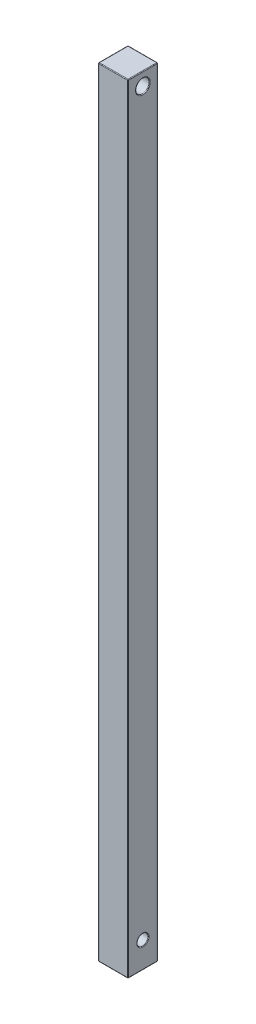
ISO-10303-21;
HEADER;
FILE_DESCRIPTION(('STEP AP214'),'2;1');
FILE_NAME('part.step','',(''),(''),'','','');
FILE_SCHEMA(('AUTOMOTIVE_DESIGN { 1 0 10303 214 1 1 1 1 }'));
ENDSEC;
DATA;
#1=APPLICATION_CONTEXT('core data for automotive mechanical design processes');
#2=APPLICATION_PROTOCOL_DEFINITION('international standard','automotive_design',2000,#1);
#3=PRODUCT_CONTEXT('',#1,'mechanical');
#4=PRODUCT('Part','Part','',(#3));
#5=PRODUCT_RELATED_PRODUCT_CATEGORY('part','',(#4));
#6=PRODUCT_DEFINITION_FORMATION('','',#4);
#7=PRODUCT_DEFINITION_CONTEXT('part definition',#1,'design');
#8=PRODUCT_DEFINITION('design','',#6,#7);
#9=PRODUCT_DEFINITION_SHAPE('','',#8);
#10=(LENGTH_UNIT() NAMED_UNIT(*) SI_UNIT(.MILLI.,.METRE.));
#11=(NAMED_UNIT(*) PLANE_ANGLE_UNIT() SI_UNIT($,.RADIAN.));
#12=(NAMED_UNIT(*) SI_UNIT($,.STERADIAN.) SOLID_ANGLE_UNIT());
#13=UNCERTAINTY_MEASURE_WITH_UNIT(LENGTH_MEASURE(1.E-05),#10,'distance_accuracy_value','');
#14=(GEOMETRIC_REPRESENTATION_CONTEXT(3) GLOBAL_UNCERTAINTY_ASSIGNED_CONTEXT((#13)) GLOBAL_UNIT_ASSIGNED_CONTEXT((#10,
#11,#12)) REPRESENTATION_CONTEXT('',''));
#15=CARTESIAN_POINT('',(0.,0.,0.));
#16=DIRECTION('',(0.,0.,1.));
#17=DIRECTION('',(1.,0.,0.));
#18=AXIS2_PLACEMENT_3D('',#15,#16,#17);
#19=CARTESIAN_POINT('',(0.,600.,0.));
#20=DIRECTION('',(1.,0.,0.));
#21=DIRECTION('',(0.,0.,-1.));
#22=AXIS2_PLACEMENT_3D('',#19,#20,#21);
#23=PLANE('',#22);
#24=CARTESIAN_POINT('',(0.,20.,-11.5));
#25=DIRECTION('',(1.,0.,0.));
#26=DIRECTION('',(0.,0.,-1.));
#27=AXIS2_PLACEMENT_3D('',#24,#25,#26);
#28=CIRCLE('',#27,4.75);
#29=CARTESIAN_POINT('',(0.,20.,-16.25));
#30=VERTEX_POINT('',#29);
#31=EDGE_CURVE('E171',#30,#30,#28,.T.);
#32=ORIENTED_EDGE('',*,*,#31,.T.);
#33=EDGE_LOOP('',(#32));
#34=FACE_BOUND('',#33,.T.);
#35=CARTESIAN_POINT('',(0.,590.,-11.5));
#36=DIRECTION('',(1.,0.,0.));
#37=DIRECTION('',(0.,0.,-1.));
#38=AXIS2_PLACEMENT_3D('',#35,#36,#37);
#39=CIRCLE('',#38,5.74999999999998);
#40=CARTESIAN_POINT('',(0.,590.,-17.25));
#41=VERTEX_POINT('',#40);
#42=EDGE_CURVE('E168',#41,#41,#39,.T.);
#43=ORIENTED_EDGE('',*,*,#42,.T.);
#44=EDGE_LOOP('',(#43));
#45=FACE_BOUND('',#44,.T.);
#46=DIRECTION('',(0.,0.,1.));
#47=VECTOR('',#46,1.);
#48=CARTESIAN_POINT('',(0.,599.5,0.));
#49=LINE('',#48,#47);
#50=CARTESIAN_POINT('',(0.,599.5,-0.5));
#51=VERTEX_POINT('',#50);
#52=CARTESIAN_POINT('',(0.,599.5,-22.5));
#53=VERTEX_POINT('',#52);
#54=EDGE_CURVE('E130',#51,#53,#49,.F.);
#55=ORIENTED_EDGE('',*,*,#54,.T.);
#56=DIRECTION('',(0.,-1.,0.));
#57=VECTOR('',#56,1.);
#58=CARTESIAN_POINT('',(0.,600.,-22.5));
#59=LINE('',#58,#57);
#60=CARTESIAN_POINT('',(0.,0.499999999999945,-22.5));
#61=VERTEX_POINT('',#60);
#62=EDGE_CURVE('E166',#53,#61,#59,.T.);
#63=ORIENTED_EDGE('',*,*,#62,.T.);
#64=DIRECTION('',(0.,0.,1.));
#65=VECTOR('',#64,1.);
#66=CARTESIAN_POINT('',(0.,0.499999999999945,0.));
#67=LINE('',#66,#65);
#68=CARTESIAN_POINT('',(0.,0.499999999999945,-0.5));
#69=VERTEX_POINT('',#68);
#70=EDGE_CURVE('E159',#61,#69,#67,.T.);
#71=ORIENTED_EDGE('',*,*,#70,.T.);
#72=DIRECTION('',(0.,-1.,0.));
#73=VECTOR('',#72,1.);
#74=CARTESIAN_POINT('',(0.,600.,-0.5));
#75=LINE('',#74,#73);
#76=EDGE_CURVE('E157',#69,#51,#75,.F.);
#77=ORIENTED_EDGE('',*,*,#76,.T.);
#78=EDGE_LOOP('',(#55,#63,#71,#77));
#79=FACE_BOUND('',#78,.T.);
#80=ADVANCED_FACE('F34',(#34,#45,#79),#23,.F.);
#81=CARTESIAN_POINT('',(0.,600.,0.));
#82=DIRECTION('',(0.,0.,-1.));
#83=DIRECTION('',(-1.,0.,0.));
#84=AXIS2_PLACEMENT_3D('',#81,#82,#83);
#85=PLANE('',#84);
#86=DIRECTION('',(1.,0.,0.));
#87=VECTOR('',#86,1.);
#88=CARTESIAN_POINT('',(0.,599.5,0.));
#89=LINE('',#88,#87);
#90=CARTESIAN_POINT('',(22.5,599.5,0.));
#91=VERTEX_POINT('',#90);
#92=CARTESIAN_POINT('',(0.5,599.5,0.));
#93=VERTEX_POINT('',#92);
#94=EDGE_CURVE('E43',#91,#93,#89,.F.);
#95=ORIENTED_EDGE('',*,*,#94,.T.);
#96=DIRECTION('',(0.,-1.,0.));
#97=VECTOR('',#96,1.);
#98=CARTESIAN_POINT('',(0.5,600.,0.));
#99=LINE('',#98,#97);
#100=CARTESIAN_POINT('',(0.5,0.499999999999945,0.));
#101=VERTEX_POINT('',#100);
#102=EDGE_CURVE('E11',#93,#101,#99,.T.);
#103=ORIENTED_EDGE('',*,*,#102,.T.);
#104=DIRECTION('',(1.,0.,0.));
#105=VECTOR('',#104,1.);
#106=CARTESIAN_POINT('',(23.,0.499999999999945,0.));
#107=LINE('',#106,#105);
#108=CARTESIAN_POINT('',(22.5,0.499999999999945,0.));
#109=VERTEX_POINT('',#108);
#110=EDGE_CURVE('E219',#101,#109,#107,.T.);
#111=ORIENTED_EDGE('',*,*,#110,.T.);
#112=DIRECTION('',(0.,-1.,0.));
#113=VECTOR('',#112,1.);
#114=CARTESIAN_POINT('',(22.5,600.,0.));
#115=LINE('',#114,#113);
#116=EDGE_CURVE('E54',#109,#91,#115,.F.);
#117=ORIENTED_EDGE('',*,*,#116,.T.);
#118=EDGE_LOOP('',(#95,#103,#111,#117));
#119=FACE_BOUND('',#118,.T.);
#120=ADVANCED_FACE('F353',(#119),#85,.F.);
#121=CARTESIAN_POINT('',(23.,600.,0.));
#122=DIRECTION('',(-1.,0.,0.));
#123=DIRECTION('',(0.,0.,1.));
#124=AXIS2_PLACEMENT_3D('',#121,#122,#123);
#125=PLANE('',#124);
#126=CARTESIAN_POINT('',(23.,20.,-11.5));
#127=DIRECTION('',(-1.,0.,0.));
#128=DIRECTION('',(0.,0.,1.));
#129=AXIS2_PLACEMENT_3D('',#126,#127,#128);
#130=CIRCLE('',#129,4.75);
#131=CARTESIAN_POINT('',(23.,20.,-6.75));
#132=VERTEX_POINT('',#131);
#133=EDGE_CURVE('E216',#132,#132,#130,.T.);
#134=ORIENTED_EDGE('',*,*,#133,.T.);
#135=EDGE_LOOP('',(#134));
#136=FACE_BOUND('',#135,.T.);
#137=CARTESIAN_POINT('',(23.,590.,-11.5));
#138=DIRECTION('',(-1.,0.,0.));
#139=DIRECTION('',(0.,0.,1.));
#140=AXIS2_PLACEMENT_3D('',#137,#138,#139);
#141=CIRCLE('',#140,5.74999999999998);
#142=CARTESIAN_POINT('',(23.,590.,-5.75000000000002));
#143=VERTEX_POINT('',#142);
#144=EDGE_CURVE('E213',#143,#143,#141,.T.);
#145=ORIENTED_EDGE('',*,*,#144,.T.);
#146=EDGE_LOOP('',(#145));
#147=FACE_BOUND('',#146,.T.);
#148=DIRECTION('',(0.,-1.,0.));
#149=VECTOR('',#148,1.);
#150=CARTESIAN_POINT('',(23.,600.,-22.5));
#151=LINE('',#150,#149);
#152=CARTESIAN_POINT('',(23.,0.499999999999945,-22.5));
#153=VERTEX_POINT('',#152);
#154=CARTESIAN_POINT('',(23.,599.5,-22.5));
#155=VERTEX_POINT('',#154);
#156=EDGE_CURVE('E208',#153,#155,#151,.F.);
#157=ORIENTED_EDGE('',*,*,#156,.T.);
#158=DIRECTION('',(0.,0.,-1.));
#159=VECTOR('',#158,1.);
#160=CARTESIAN_POINT('',(23.,599.5,0.));
#161=LINE('',#160,#159);
#162=CARTESIAN_POINT('',(23.,599.5,-0.5));
#163=VERTEX_POINT('',#162);
#164=EDGE_CURVE('E210',#155,#163,#161,.F.);
#165=ORIENTED_EDGE('',*,*,#164,.T.);
#166=DIRECTION('',(0.,-1.,0.));
#167=VECTOR('',#166,1.);
#168=CARTESIAN_POINT('',(23.,600.,-0.5));
#169=LINE('',#168,#167);
#170=CARTESIAN_POINT('',(23.,0.499999999999945,-0.5));
#171=VERTEX_POINT('',#170);
#172=EDGE_CURVE('E204',#163,#171,#169,.T.);
#173=ORIENTED_EDGE('',*,*,#172,.T.);
#174=DIRECTION('',(0.,0.,-1.));
#175=VECTOR('',#174,1.);
#176=CARTESIAN_POINT('',(23.,0.499999999999945,-23.));
#177=LINE('',#176,#175);
#178=EDGE_CURVE('E206',#171,#153,#177,.T.);
#179=ORIENTED_EDGE('',*,*,#178,.T.);
#180=EDGE_LOOP('',(#157,#165,#173,#179));
#181=FACE_BOUND('',#180,.T.);
#182=ADVANCED_FACE('F303',(#136,#147,#181),#125,.F.);
#183=CARTESIAN_POINT('',(0.,600.,-23.));
#184=DIRECTION('',(0.,0.,1.));
#185=DIRECTION('',(1.,0.,0.));
#186=AXIS2_PLACEMENT_3D('',#183,#184,#185);
#187=PLANE('',#186);
#188=DIRECTION('',(0.,-1.,0.));
#189=VECTOR('',#188,1.);
#190=CARTESIAN_POINT('',(0.5,600.,-23.));
#191=LINE('',#190,#189);
#192=CARTESIAN_POINT('',(0.5,0.499999999999945,-23.));
#193=VERTEX_POINT('',#192);
#194=CARTESIAN_POINT('',(0.5,599.5,-23.));
#195=VERTEX_POINT('',#194);
#196=EDGE_CURVE('E199',#193,#195,#191,.F.);
#197=ORIENTED_EDGE('',*,*,#196,.T.);
#198=DIRECTION('',(-1.,0.,0.));
#199=VECTOR('',#198,1.);
#200=CARTESIAN_POINT('',(0.,599.5,-23.));
#201=LINE('',#200,#199);
#202=CARTESIAN_POINT('',(22.5,599.5,-23.));
#203=VERTEX_POINT('',#202);
#204=EDGE_CURVE('E201',#195,#203,#201,.F.);
#205=ORIENTED_EDGE('',*,*,#204,.T.);
#206=DIRECTION('',(0.,-1.,0.));
#207=VECTOR('',#206,1.);
#208=CARTESIAN_POINT('',(22.5,600.,-23.));
#209=LINE('',#208,#207);
#210=CARTESIAN_POINT('',(22.5,0.499999999999945,-23.));
#211=VERTEX_POINT('',#210);
#212=EDGE_CURVE('E195',#203,#211,#209,.T.);
#213=ORIENTED_EDGE('',*,*,#212,.T.);
#214=DIRECTION('',(-1.,0.,0.));
#215=VECTOR('',#214,1.);
#216=CARTESIAN_POINT('',(0.,0.499999999999945,-23.));
#217=LINE('',#216,#215);
#218=EDGE_CURVE('E197',#211,#193,#217,.T.);
#219=ORIENTED_EDGE('',*,*,#218,.T.);
#220=EDGE_LOOP('',(#197,#205,#213,#219));
#221=FACE_BOUND('',#220,.T.);
#222=ADVANCED_FACE('F294',(#221),#187,.F.);
#223=CARTESIAN_POINT('',(0.,600.,0.));
#224=DIRECTION('',(0.,-1.,0.));
#225=DIRECTION('',(0.,0.,-1.));
#226=AXIS2_PLACEMENT_3D('',#223,#224,#225);
#227=PLANE('',#226);
#228=DIRECTION('',(-1.,0.,0.));
#229=VECTOR('',#228,1.);
#230=CARTESIAN_POINT('',(0.,600.,-22.5));
#231=LINE('',#230,#229);
#232=CARTESIAN_POINT('',(22.5,600.,-22.5));
#233=VERTEX_POINT('',#232);
#234=CARTESIAN_POINT('',(0.5,600.,-22.5));
#235=VERTEX_POINT('',#234);
#236=EDGE_CURVE('E155',#233,#235,#231,.T.);
#237=ORIENTED_EDGE('',*,*,#236,.T.);
#238=DIRECTION('',(0.,0.,1.));
#239=VECTOR('',#238,1.);
#240=CARTESIAN_POINT('',(0.5,600.,0.));
#241=LINE('',#240,#239);
#242=CARTESIAN_POINT('',(0.5,600.,-0.5));
#243=VERTEX_POINT('',#242);
#244=EDGE_CURVE('E128',#235,#243,#241,.T.);
#245=ORIENTED_EDGE('',*,*,#244,.T.);
#246=DIRECTION('',(1.,0.,0.));
#247=VECTOR('',#246,1.);
#248=CARTESIAN_POINT('',(0.,600.,-0.5));
#249=LINE('',#248,#247);
#250=CARTESIAN_POINT('',(22.5,600.,-0.5));
#251=VERTEX_POINT('',#250);
#252=EDGE_CURVE('E145',#243,#251,#249,.T.);
#253=ORIENTED_EDGE('',*,*,#252,.T.);
#254=DIRECTION('',(0.,0.,-1.));
#255=VECTOR('',#254,1.);
#256=CARTESIAN_POINT('',(22.5,600.,0.));
#257=LINE('',#256,#255);
#258=EDGE_CURVE('E151',#251,#233,#257,.T.);
#259=ORIENTED_EDGE('',*,*,#258,.T.);
#260=EDGE_LOOP('',(#237,#245,#253,#259));
#261=FACE_BOUND('',#260,.T.);
#262=ADVANCED_FACE('F153',(#261),#227,.F.);
#263=CARTESIAN_POINT('',(0.,0.,0.));
#264=DIRECTION('',(0.,-1.,0.));
#265=DIRECTION('',(0.,0.,-1.));
#266=AXIS2_PLACEMENT_3D('',#263,#264,#265);
#267=PLANE('',#266);
#268=DIRECTION('',(1.,0.,0.));
#269=VECTOR('',#268,1.);
#270=CARTESIAN_POINT('',(0.,0.,-0.5));
#271=LINE('',#270,#269);
#272=CARTESIAN_POINT('',(22.5,0.,-0.5));
#273=VERTEX_POINT('',#272);
#274=CARTESIAN_POINT('',(0.5,0.,-0.5));
#275=VERTEX_POINT('',#274);
#276=EDGE_CURVE('E174',#273,#275,#271,.F.);
#277=ORIENTED_EDGE('',*,*,#276,.T.);
#278=DIRECTION('',(0.,0.,1.));
#279=VECTOR('',#278,1.);
#280=CARTESIAN_POINT('',(0.5,0.,-23.));
#281=LINE('',#280,#279);
#282=CARTESIAN_POINT('',(0.5,0.,-22.5));
#283=VERTEX_POINT('',#282);
#284=EDGE_CURVE('E180',#275,#283,#281,.F.);
#285=ORIENTED_EDGE('',*,*,#284,.T.);
#286=DIRECTION('',(-1.,0.,0.));
#287=VECTOR('',#286,1.);
#288=CARTESIAN_POINT('',(23.,0.,-22.5));
#289=LINE('',#288,#287);
#290=CARTESIAN_POINT('',(22.5,0.,-22.5));
#291=VERTEX_POINT('',#290);
#292=EDGE_CURVE('E178',#283,#291,#289,.F.);
#293=ORIENTED_EDGE('',*,*,#292,.T.);
#294=DIRECTION('',(0.,0.,-1.));
#295=VECTOR('',#294,1.);
#296=CARTESIAN_POINT('',(22.5,0.,0.));
#297=LINE('',#296,#295);
#298=EDGE_CURVE('E176',#291,#273,#297,.F.);
#299=ORIENTED_EDGE('',*,*,#298,.T.);
#300=EDGE_LOOP('',(#277,#285,#293,#299));
#301=FACE_BOUND('',#300,.T.);
#302=ADVANCED_FACE('F322',(#301),#267,.T.);
#303=CARTESIAN_POINT('',(-327.,20.,-11.5));
#304=DIRECTION('',(1.,0.,0.));
#305=DIRECTION('',(0.,0.,-1.));
#306=AXIS2_PLACEMENT_3D('',#303,#304,#305);
#307=CYLINDRICAL_SURFACE('',#306,4.25);
#308=CARTESIAN_POINT('',(0.5,20.,-11.5));
#309=DIRECTION('',(1.,0.,0.));
#310=DIRECTION('',(0.,0.,-1.));
#311=AXIS2_PLACEMENT_3D('',#308,#309,#310);
#312=CIRCLE('',#311,4.25);
#313=CARTESIAN_POINT('',(0.5,20.,-15.75));
#314=VERTEX_POINT('',#313);
#315=EDGE_CURVE('E186',#314,#314,#312,.F.);
#316=ORIENTED_EDGE('',*,*,#315,.T.);
#317=EDGE_LOOP('',(#316));
#318=FACE_BOUND('',#317,.T.);
#319=CARTESIAN_POINT('',(22.5,20.,-11.5));
#320=DIRECTION('',(-1.,0.,0.));
#321=DIRECTION('',(0.,0.,1.));
#322=AXIS2_PLACEMENT_3D('',#319,#320,#321);
#323=CIRCLE('',#322,4.25);
#324=CARTESIAN_POINT('',(22.5,20.,-7.25));
#325=VERTEX_POINT('',#324);
#326=EDGE_CURVE('E183',#325,#325,#323,.F.);
#327=ORIENTED_EDGE('',*,*,#326,.T.);
#328=EDGE_LOOP('',(#327));
#329=FACE_BOUND('',#328,.T.);
#330=ADVANCED_FACE('F553',(#318,#329),#307,.F.);
#331=CARTESIAN_POINT('',(-26.,590.,-11.5));
#332=DIRECTION('',(1.,0.,0.));
#333=DIRECTION('',(0.,0.,-1.));
#334=AXIS2_PLACEMENT_3D('',#331,#332,#333);
#335=CYLINDRICAL_SURFACE('',#334,5.24999999999998);
#336=CARTESIAN_POINT('',(0.5,590.,-11.5));
#337=DIRECTION('',(1.,0.,0.));
#338=DIRECTION('',(0.,0.,-1.));
#339=AXIS2_PLACEMENT_3D('',#336,#337,#338);
#340=CIRCLE('',#339,5.24999999999998);
#341=CARTESIAN_POINT('',(0.5,590.,-16.75));
#342=VERTEX_POINT('',#341);
#343=EDGE_CURVE('E192',#342,#342,#340,.F.);
#344=ORIENTED_EDGE('',*,*,#343,.T.);
#345=EDGE_LOOP('',(#344));
#346=FACE_BOUND('',#345,.T.);
#347=CARTESIAN_POINT('',(22.5,590.,-11.5));
#348=DIRECTION('',(-1.,0.,0.));
#349=DIRECTION('',(0.,0.,1.));
#350=AXIS2_PLACEMENT_3D('',#347,#348,#349);
#351=CIRCLE('',#350,5.24999999999998);
#352=CARTESIAN_POINT('',(22.5,590.,-6.25000000000002));
#353=VERTEX_POINT('',#352);
#354=EDGE_CURVE('E189',#353,#353,#351,.F.);
#355=ORIENTED_EDGE('',*,*,#354,.T.);
#356=EDGE_LOOP('',(#355));
#357=FACE_BOUND('',#356,.T.);
#358=ADVANCED_FACE('F545',(#346,#357),#335,.F.);
#359=CARTESIAN_POINT('',(22.5,0.499999999999945,0.));
#360=DIRECTION('',(0.,0.,1.));
#361=DIRECTION('',(1.,0.,0.));
#362=AXIS2_PLACEMENT_3D('',#359,#360,#361);
#363=CYLINDRICAL_SURFACE('',#362,0.5);
#364=CARTESIAN_POINT('',(22.5,0.499999999999945,-22.5));
#365=DIRECTION('',(0.,0.,-1.));
#366=DIRECTION('',(-1.,0.,0.));
#367=AXIS2_PLACEMENT_3D('',#364,#365,#366);
#368=CIRCLE('',#367,0.5);
#369=EDGE_CURVE('E38',#153,#291,#368,.T.);
#370=ORIENTED_EDGE('',*,*,#369,.F.);
#371=ORIENTED_EDGE('',*,*,#178,.F.);
#372=CARTESIAN_POINT('',(22.5,0.5,-0.5));
#373=DIRECTION('',(0.,0.,1.));
#374=DIRECTION('',(1.,0.,0.));
#375=AXIS2_PLACEMENT_3D('',#372,#373,#374);
#376=CIRCLE('',#375,0.5);
#377=EDGE_CURVE('E271',#273,#171,#376,.T.);
#378=ORIENTED_EDGE('',*,*,#377,.F.);
#379=ORIENTED_EDGE('',*,*,#298,.F.);
#380=EDGE_LOOP('',(#370,#371,#378,#379));
#381=FACE_BOUND('',#380,.T.);
#382=ADVANCED_FACE('F313',(#381),#363,.T.);
#383=CARTESIAN_POINT('',(22.5,0.5,-22.5));
#384=DIRECTION('',(0.,0.,1.));
#385=DIRECTION('',(1.,0.,0.));
#386=AXIS2_PLACEMENT_3D('',#383,#384,#385);
#387=SPHERICAL_SURFACE('',#386,0.5);
#388=CARTESIAN_POINT('',(22.5,0.499999999999945,-22.5));
#389=DIRECTION('',(0.,-1.,0.));
#390=DIRECTION('',(0.,0.,-1.));
#391=AXIS2_PLACEMENT_3D('',#388,#389,#390);
#392=CIRCLE('',#391,0.5);
#393=EDGE_CURVE('E266',#153,#211,#392,.F.);
#394=ORIENTED_EDGE('',*,*,#393,.F.);
#395=ORIENTED_EDGE('',*,*,#369,.T.);
#396=CARTESIAN_POINT('',(22.5,0.5,-22.5));
#397=DIRECTION('',(1.,0.,0.));
#398=DIRECTION('',(0.,0.,-1.));
#399=AXIS2_PLACEMENT_3D('',#396,#397,#398);
#400=CIRCLE('',#399,0.5);
#401=EDGE_CURVE('E269',#211,#291,#400,.F.);
#402=ORIENTED_EDGE('',*,*,#401,.F.);
#403=EDGE_LOOP('',(#394,#395,#402));
#404=FACE_BOUND('',#403,.T.);
#405=ADVANCED_FACE('F282',(#404),#387,.T.);
#406=CARTESIAN_POINT('',(22.5,0.5,-0.5));
#407=DIRECTION('',(0.,0.,1.));
#408=DIRECTION('',(1.,0.,0.));
#409=AXIS2_PLACEMENT_3D('',#406,#407,#408);
#410=SPHERICAL_SURFACE('',#409,0.5);
#411=CARTESIAN_POINT('',(22.5,0.499999999999945,-0.5));
#412=DIRECTION('',(1.,0.,0.));
#413=DIRECTION('',(0.,0.,-1.));
#414=AXIS2_PLACEMENT_3D('',#411,#412,#413);
#415=CIRCLE('',#414,0.5);
#416=EDGE_CURVE('E260',#273,#109,#415,.F.);
#417=ORIENTED_EDGE('',*,*,#416,.F.);
#418=ORIENTED_EDGE('',*,*,#377,.T.);
#419=CARTESIAN_POINT('',(22.5,0.499999999999945,-0.5));
#420=DIRECTION('',(0.,-1.,0.));
#421=DIRECTION('',(0.,0.,-1.));
#422=AXIS2_PLACEMENT_3D('',#419,#420,#421);
#423=CIRCLE('',#422,0.5);
#424=EDGE_CURVE('E263',#109,#171,#423,.F.);
#425=ORIENTED_EDGE('',*,*,#424,.F.);
#426=EDGE_LOOP('',(#417,#418,#425));
#427=FACE_BOUND('',#426,.T.);
#428=ADVANCED_FACE('F315',(#427),#410,.T.);
#429=CARTESIAN_POINT('',(0.,0.499999999999945,-22.5));
#430=DIRECTION('',(1.,0.,0.));
#431=DIRECTION('',(0.,0.,-1.));
#432=AXIS2_PLACEMENT_3D('',#429,#430,#431);
#433=CYLINDRICAL_SURFACE('',#432,0.5);
#434=ORIENTED_EDGE('',*,*,#401,.T.);
#435=ORIENTED_EDGE('',*,*,#292,.F.);
#436=CARTESIAN_POINT('',(0.5,0.499999999999945,-22.5));
#437=DIRECTION('',(-1.,0.,0.));
#438=DIRECTION('',(0.,0.,1.));
#439=AXIS2_PLACEMENT_3D('',#436,#437,#438);
#440=CIRCLE('',#439,0.5);
#441=EDGE_CURVE('E255',#193,#283,#440,.T.);
#442=ORIENTED_EDGE('',*,*,#441,.F.);
#443=ORIENTED_EDGE('',*,*,#218,.F.);
#444=EDGE_LOOP('',(#434,#435,#442,#443));
#445=FACE_BOUND('',#444,.T.);
#446=ADVANCED_FACE('F290',(#445),#433,.T.);
#447=CARTESIAN_POINT('',(22.5,600.,-22.5));
#448=DIRECTION('',(0.,-1.,0.));
#449=DIRECTION('',(0.,0.,-1.));
#450=AXIS2_PLACEMENT_3D('',#447,#448,#449);
#451=CYLINDRICAL_SURFACE('',#450,0.5);
#452=ORIENTED_EDGE('',*,*,#393,.T.);
#453=ORIENTED_EDGE('',*,*,#212,.F.);
#454=CARTESIAN_POINT('',(22.5,599.5,-22.5));
#455=DIRECTION('',(0.,1.,0.));
#456=DIRECTION('',(0.,0.,1.));
#457=AXIS2_PLACEMENT_3D('',#454,#455,#456);
#458=CIRCLE('',#457,0.5);
#459=EDGE_CURVE('E252',#155,#203,#458,.T.);
#460=ORIENTED_EDGE('',*,*,#459,.F.);
#461=ORIENTED_EDGE('',*,*,#156,.F.);
#462=EDGE_LOOP('',(#452,#453,#460,#461));
#463=FACE_BOUND('',#462,.T.);
#464=ADVANCED_FACE('F300',(#463),#451,.T.);
#465=CARTESIAN_POINT('',(22.5,599.5,0.));
#466=DIRECTION('',(0.,0.,-1.));
#467=DIRECTION('',(-1.,0.,0.));
#468=AXIS2_PLACEMENT_3D('',#465,#466,#467);
#469=CYLINDRICAL_SURFACE('',#468,0.5);
#470=CARTESIAN_POINT('',(22.5,599.5,-0.5));
#471=DIRECTION('',(0.,0.,1.));
#472=DIRECTION('',(1.,0.,0.));
#473=AXIS2_PLACEMENT_3D('',#470,#471,#472);
#474=CIRCLE('',#473,0.5);
#475=EDGE_CURVE('E246',#163,#251,#474,.T.);
#476=ORIENTED_EDGE('',*,*,#475,.F.);
#477=ORIENTED_EDGE('',*,*,#164,.F.);
#478=CARTESIAN_POINT('',(22.5,599.5,-22.5));
#479=DIRECTION('',(0.,0.,-1.));
#480=DIRECTION('',(-1.,0.,0.));
#481=AXIS2_PLACEMENT_3D('',#478,#479,#480);
#482=CIRCLE('',#481,0.5);
#483=EDGE_CURVE('E249',#233,#155,#482,.T.);
#484=ORIENTED_EDGE('',*,*,#483,.F.);
#485=ORIENTED_EDGE('',*,*,#258,.F.);
#486=EDGE_LOOP('',(#476,#477,#484,#485));
#487=FACE_BOUND('',#486,.T.);
#488=ADVANCED_FACE('F307',(#487),#469,.T.);
#489=CARTESIAN_POINT('',(22.5,600.,-0.5));
#490=DIRECTION('',(0.,-1.,0.));
#491=DIRECTION('',(0.,0.,-1.));
#492=AXIS2_PLACEMENT_3D('',#489,#490,#491);
#493=CYLINDRICAL_SURFACE('',#492,0.5);
#494=ORIENTED_EDGE('',*,*,#424,.T.);
#495=ORIENTED_EDGE('',*,*,#172,.F.);
#496=CARTESIAN_POINT('',(22.5,599.5,-0.5));
#497=DIRECTION('',(0.,1.,0.));
#498=DIRECTION('',(0.,0.,1.));
#499=AXIS2_PLACEMENT_3D('',#496,#497,#498);
#500=CIRCLE('',#499,0.5);
#501=EDGE_CURVE('E244',#91,#163,#500,.T.);
#502=ORIENTED_EDGE('',*,*,#501,.F.);
#503=ORIENTED_EDGE('',*,*,#116,.F.);
#504=EDGE_LOOP('',(#494,#495,#502,#503));
#505=FACE_BOUND('',#504,.T.);
#506=ADVANCED_FACE('F312',(#505),#493,.T.);
#507=CARTESIAN_POINT('',(0.,0.499999999999945,-0.5));
#508=DIRECTION('',(-1.,0.,0.));
#509=DIRECTION('',(0.,0.,1.));
#510=AXIS2_PLACEMENT_3D('',#507,#508,#509);
#511=CYLINDRICAL_SURFACE('',#510,0.5);
#512=ORIENTED_EDGE('',*,*,#416,.T.);
#513=ORIENTED_EDGE('',*,*,#110,.F.);
#514=CARTESIAN_POINT('',(0.5,0.5,-0.5));
#515=DIRECTION('',(-1.,0.,0.));
#516=DIRECTION('',(0.,0.,1.));
#517=AXIS2_PLACEMENT_3D('',#514,#515,#516);
#518=CIRCLE('',#517,0.5);
#519=EDGE_CURVE('E241',#275,#101,#518,.T.);
#520=ORIENTED_EDGE('',*,*,#519,.F.);
#521=ORIENTED_EDGE('',*,*,#276,.F.);
#522=EDGE_LOOP('',(#512,#513,#520,#521));
#523=FACE_BOUND('',#522,.T.);
#524=ADVANCED_FACE('F319',(#523),#511,.T.);
#525=CARTESIAN_POINT('',(0.5,0.499999999999945,0.));
#526=DIRECTION('',(0.,0.,-1.));
#527=DIRECTION('',(-1.,0.,0.));
#528=AXIS2_PLACEMENT_3D('',#525,#526,#527);
#529=CYLINDRICAL_SURFACE('',#528,0.5);
#530=CARTESIAN_POINT('',(0.5,0.5,-22.5));
#531=DIRECTION('',(0.,0.,-1.));
#532=DIRECTION('',(-1.,0.,0.));
#533=AXIS2_PLACEMENT_3D('',#530,#531,#532);
#534=CIRCLE('',#533,0.5);
#535=EDGE_CURVE('E257',#283,#61,#534,.T.);
#536=ORIENTED_EDGE('',*,*,#535,.F.);
#537=ORIENTED_EDGE('',*,*,#284,.F.);
#538=CARTESIAN_POINT('',(0.5,0.499999999999945,-0.5));
#539=DIRECTION('',(0.,0.,1.));
#540=DIRECTION('',(1.,0.,0.));
#541=AXIS2_PLACEMENT_3D('',#538,#539,#540);
#542=CIRCLE('',#541,0.5);
#543=EDGE_CURVE('E238',#69,#275,#542,.T.);
#544=ORIENTED_EDGE('',*,*,#543,.F.);
#545=ORIENTED_EDGE('',*,*,#70,.F.);
#546=EDGE_LOOP('',(#536,#537,#544,#545));
#547=FACE_BOUND('',#546,.T.);
#548=ADVANCED_FACE('F326',(#547),#529,.T.);
#549=CARTESIAN_POINT('',(0.5,0.5,-22.5));
#550=DIRECTION('',(0.,0.,1.));
#551=DIRECTION('',(1.,0.,0.));
#552=AXIS2_PLACEMENT_3D('',#549,#550,#551);
#553=SPHERICAL_SURFACE('',#552,0.5);
#554=ORIENTED_EDGE('',*,*,#441,.T.);
#555=ORIENTED_EDGE('',*,*,#535,.T.);
#556=CARTESIAN_POINT('',(0.5,0.499999999999945,-22.5));
#557=DIRECTION('',(0.,-1.,0.));
#558=DIRECTION('',(0.,0.,-1.));
#559=AXIS2_PLACEMENT_3D('',#556,#557,#558);
#560=CIRCLE('',#559,0.5);
#561=EDGE_CURVE('E235',#193,#61,#560,.F.);
#562=ORIENTED_EDGE('',*,*,#561,.F.);
#563=EDGE_LOOP('',(#554,#555,#562));
#564=FACE_BOUND('',#563,.T.);
#565=ADVANCED_FACE('F330',(#564),#553,.T.);
#566=CARTESIAN_POINT('',(22.5,599.5,-22.5));
#567=DIRECTION('',(0.,0.,1.));
#568=DIRECTION('',(1.,0.,0.));
#569=AXIS2_PLACEMENT_3D('',#566,#567,#568);
#570=SPHERICAL_SURFACE('',#569,0.5);
#571=ORIENTED_EDGE('',*,*,#483,.T.);
#572=ORIENTED_EDGE('',*,*,#459,.T.);
#573=CARTESIAN_POINT('',(22.5,599.5,-22.5));
#574=DIRECTION('',(1.,0.,0.));
#575=DIRECTION('',(0.,0.,-1.));
#576=AXIS2_PLACEMENT_3D('',#573,#574,#575);
#577=CIRCLE('',#576,0.5);
#578=EDGE_CURVE('E233',#233,#203,#577,.F.);
#579=ORIENTED_EDGE('',*,*,#578,.F.);
#580=EDGE_LOOP('',(#571,#572,#579));
#581=FACE_BOUND('',#580,.T.);
#582=ADVANCED_FACE('F341',(#581),#570,.T.);
#583=CARTESIAN_POINT('',(22.5,599.5,-0.5));
#584=DIRECTION('',(0.,0.,1.));
#585=DIRECTION('',(1.,0.,0.));
#586=AXIS2_PLACEMENT_3D('',#583,#584,#585);
#587=SPHERICAL_SURFACE('',#586,0.5);
#588=ORIENTED_EDGE('',*,*,#501,.T.);
#589=ORIENTED_EDGE('',*,*,#475,.T.);
#590=CARTESIAN_POINT('',(22.5,599.5,-0.5));
#591=DIRECTION('',(1.,0.,0.));
#592=DIRECTION('',(0.,0.,-1.));
#593=AXIS2_PLACEMENT_3D('',#590,#591,#592);
#594=CIRCLE('',#593,0.5);
#595=EDGE_CURVE('E148',#91,#251,#594,.F.);
#596=ORIENTED_EDGE('',*,*,#595,.F.);
#597=EDGE_LOOP('',(#588,#589,#596));
#598=FACE_BOUND('',#597,.T.);
#599=ADVANCED_FACE('F343',(#598),#587,.T.);
#600=CARTESIAN_POINT('',(0.5,0.5,-0.5));
#601=DIRECTION('',(0.,0.,1.));
#602=DIRECTION('',(1.,0.,0.));
#603=AXIS2_PLACEMENT_3D('',#600,#601,#602);
#604=SPHERICAL_SURFACE('',#603,0.5);
#605=ORIENTED_EDGE('',*,*,#543,.T.);
#606=ORIENTED_EDGE('',*,*,#519,.T.);
#607=CARTESIAN_POINT('',(0.5,0.499999999999945,-0.5));
#608=DIRECTION('',(0.,-1.,0.));
#609=DIRECTION('',(0.,0.,-1.));
#610=AXIS2_PLACEMENT_3D('',#607,#608,#609);
#611=CIRCLE('',#610,0.5);
#612=EDGE_CURVE('E230',#69,#101,#611,.F.);
#613=ORIENTED_EDGE('',*,*,#612,.F.);
#614=EDGE_LOOP('',(#605,#606,#613));
#615=FACE_BOUND('',#614,.T.);
#616=ADVANCED_FACE('F349',(#615),#604,.T.);
#617=CARTESIAN_POINT('',(0.5,600.,-22.5));
#618=DIRECTION('',(0.,-1.,0.));
#619=DIRECTION('',(0.,0.,-1.));
#620=AXIS2_PLACEMENT_3D('',#617,#618,#619);
#621=CYLINDRICAL_SURFACE('',#620,0.5);
#622=ORIENTED_EDGE('',*,*,#561,.T.);
#623=ORIENTED_EDGE('',*,*,#62,.F.);
#624=CARTESIAN_POINT('',(0.5,599.5,-22.5));
#625=DIRECTION('',(0.,1.,0.));
#626=DIRECTION('',(0.,0.,1.));
#627=AXIS2_PLACEMENT_3D('',#624,#625,#626);
#628=CIRCLE('',#627,0.5);
#629=EDGE_CURVE('E227',#195,#53,#628,.T.);
#630=ORIENTED_EDGE('',*,*,#629,.F.);
#631=ORIENTED_EDGE('',*,*,#196,.F.);
#632=EDGE_LOOP('',(#622,#623,#630,#631));
#633=FACE_BOUND('',#632,.T.);
#634=ADVANCED_FACE('F333',(#633),#621,.T.);
#635=CARTESIAN_POINT('',(0.,599.5,-22.5));
#636=DIRECTION('',(-1.,0.,0.));
#637=DIRECTION('',(0.,0.,1.));
#638=AXIS2_PLACEMENT_3D('',#635,#636,#637);
#639=CYLINDRICAL_SURFACE('',#638,0.5);
#640=ORIENTED_EDGE('',*,*,#578,.T.);
#641=ORIENTED_EDGE('',*,*,#204,.F.);
#642=CARTESIAN_POINT('',(0.5,599.5,-22.5));
#643=DIRECTION('',(-1.,0.,0.));
#644=DIRECTION('',(0.,0.,1.));
#645=AXIS2_PLACEMENT_3D('',#642,#643,#644);
#646=CIRCLE('',#645,0.5);
#647=EDGE_CURVE('E142',#235,#195,#646,.T.);
#648=ORIENTED_EDGE('',*,*,#647,.F.);
#649=ORIENTED_EDGE('',*,*,#236,.F.);
#650=EDGE_LOOP('',(#640,#641,#648,#649));
#651=FACE_BOUND('',#650,.T.);
#652=ADVANCED_FACE('F339',(#651),#639,.T.);
#653=CARTESIAN_POINT('',(0.,599.5,-0.5));
#654=DIRECTION('',(1.,0.,0.));
#655=DIRECTION('',(0.,0.,-1.));
#656=AXIS2_PLACEMENT_3D('',#653,#654,#655);
#657=CYLINDRICAL_SURFACE('',#656,0.5);
#658=ORIENTED_EDGE('',*,*,#595,.T.);
#659=ORIENTED_EDGE('',*,*,#252,.F.);
#660=CARTESIAN_POINT('',(0.5,599.5,-0.5));
#661=DIRECTION('',(-1.,0.,0.));
#662=DIRECTION('',(0.,0.,1.));
#663=AXIS2_PLACEMENT_3D('',#660,#661,#662);
#664=CIRCLE('',#663,0.5);
#665=EDGE_CURVE('E136',#93,#243,#664,.T.);
#666=ORIENTED_EDGE('',*,*,#665,.F.);
#667=ORIENTED_EDGE('',*,*,#94,.F.);
#668=EDGE_LOOP('',(#658,#659,#666,#667));
#669=FACE_BOUND('',#668,.T.);
#670=ADVANCED_FACE('F146',(#669),#657,.T.);
#671=CARTESIAN_POINT('',(0.5,600.,-0.5));
#672=DIRECTION('',(0.,-1.,0.));
#673=DIRECTION('',(0.,0.,-1.));
#674=AXIS2_PLACEMENT_3D('',#671,#672,#673);
#675=CYLINDRICAL_SURFACE('',#674,0.5);
#676=ORIENTED_EDGE('',*,*,#612,.T.);
#677=ORIENTED_EDGE('',*,*,#102,.F.);
#678=CARTESIAN_POINT('',(0.5,599.5,-0.5));
#679=DIRECTION('',(0.,1.,0.));
#680=DIRECTION('',(0.,0.,1.));
#681=AXIS2_PLACEMENT_3D('',#678,#679,#680);
#682=CIRCLE('',#681,0.5);
#683=EDGE_CURVE('E140',#51,#93,#682,.T.);
#684=ORIENTED_EDGE('',*,*,#683,.F.);
#685=ORIENTED_EDGE('',*,*,#76,.F.);
#686=EDGE_LOOP('',(#676,#677,#684,#685));
#687=FACE_BOUND('',#686,.T.);
#688=ADVANCED_FACE('F370',(#687),#675,.T.);
#689=CARTESIAN_POINT('',(0.5,599.5,-22.5));
#690=DIRECTION('',(0.,0.,1.));
#691=DIRECTION('',(1.,0.,0.));
#692=AXIS2_PLACEMENT_3D('',#689,#690,#691);
#693=SPHERICAL_SURFACE('',#692,0.5);
#694=ORIENTED_EDGE('',*,*,#647,.T.);
#695=ORIENTED_EDGE('',*,*,#629,.T.);
#696=CARTESIAN_POINT('',(0.5,599.5,-22.5));
#697=DIRECTION('',(0.,0.,-1.));
#698=DIRECTION('',(-1.,0.,0.));
#699=AXIS2_PLACEMENT_3D('',#696,#697,#698);
#700=CIRCLE('',#699,0.5);
#701=EDGE_CURVE('E133',#235,#53,#700,.F.);
#702=ORIENTED_EDGE('',*,*,#701,.F.);
#703=EDGE_LOOP('',(#694,#695,#702));
#704=FACE_BOUND('',#703,.T.);
#705=ADVANCED_FACE('F337',(#704),#693,.T.);
#706=CARTESIAN_POINT('',(0.5,599.5,-0.5));
#707=DIRECTION('',(0.,0.,1.));
#708=DIRECTION('',(1.,0.,0.));
#709=AXIS2_PLACEMENT_3D('',#706,#707,#708);
#710=SPHERICAL_SURFACE('',#709,0.5);
#711=ORIENTED_EDGE('',*,*,#683,.T.);
#712=ORIENTED_EDGE('',*,*,#665,.T.);
#713=CARTESIAN_POINT('',(0.5,599.5,-0.5));
#714=DIRECTION('',(0.,0.,1.));
#715=DIRECTION('',(1.,0.,0.));
#716=AXIS2_PLACEMENT_3D('',#713,#714,#715);
#717=CIRCLE('',#716,0.5);
#718=EDGE_CURVE('E124',#51,#243,#717,.F.);
#719=ORIENTED_EDGE('',*,*,#718,.F.);
#720=EDGE_LOOP('',(#711,#712,#719));
#721=FACE_BOUND('',#720,.T.);
#722=ADVANCED_FACE('F138',(#721),#710,.T.);
#723=CARTESIAN_POINT('',(0.5,599.5,0.));
#724=DIRECTION('',(0.,0.,1.));
#725=DIRECTION('',(1.,0.,0.));
#726=AXIS2_PLACEMENT_3D('',#723,#724,#725);
#727=CYLINDRICAL_SURFACE('',#726,0.5);
#728=ORIENTED_EDGE('',*,*,#701,.T.);
#729=ORIENTED_EDGE('',*,*,#54,.F.);
#730=ORIENTED_EDGE('',*,*,#718,.T.);
#731=ORIENTED_EDGE('',*,*,#244,.F.);
#732=EDGE_LOOP('',(#728,#729,#730,#731));
#733=FACE_BOUND('',#732,.T.);
#734=ADVANCED_FACE('F126',(#733),#727,.T.);
#735=CARTESIAN_POINT('',(0.5,20.,-11.5));
#736=DIRECTION('',(1.,0.,0.));
#737=DIRECTION('',(0.,0.,-1.));
#738=AXIS2_PLACEMENT_3D('',#735,#736,#737);
#739=TOROIDAL_SURFACE('',#738,4.75,0.5);
#740=ORIENTED_EDGE('',*,*,#315,.F.);
#741=EDGE_LOOP('',(#740));
#742=FACE_BOUND('',#741,.T.);
#743=ORIENTED_EDGE('',*,*,#31,.F.);
#744=EDGE_LOOP('',(#743));
#745=FACE_BOUND('',#744,.T.);
#746=ADVANCED_FACE('F365',(#742,#745),#739,.T.);
#747=CARTESIAN_POINT('',(0.5,590.,-11.5));
#748=DIRECTION('',(1.,0.,0.));
#749=DIRECTION('',(0.,0.,-1.));
#750=AXIS2_PLACEMENT_3D('',#747,#748,#749);
#751=TOROIDAL_SURFACE('',#750,5.74999999999998,0.5);
#752=ORIENTED_EDGE('',*,*,#343,.F.);
#753=EDGE_LOOP('',(#752));
#754=FACE_BOUND('',#753,.T.);
#755=ORIENTED_EDGE('',*,*,#42,.F.);
#756=EDGE_LOOP('',(#755));
#757=FACE_BOUND('',#756,.T.);
#758=ADVANCED_FACE('F422',(#754,#757),#751,.T.);
#759=CARTESIAN_POINT('',(22.5,20.,-11.5));
#760=DIRECTION('',(-1.,0.,0.));
#761=DIRECTION('',(0.,0.,1.));
#762=AXIS2_PLACEMENT_3D('',#759,#760,#761);
#763=TOROIDAL_SURFACE('',#762,4.75,0.5);
#764=ORIENTED_EDGE('',*,*,#133,.F.);
#765=EDGE_LOOP('',(#764));
#766=FACE_BOUND('',#765,.T.);
#767=ORIENTED_EDGE('',*,*,#326,.F.);
#768=EDGE_LOOP('',(#767));
#769=FACE_BOUND('',#768,.T.);
#770=ADVANCED_FACE('F430',(#766,#769),#763,.T.);
#771=CARTESIAN_POINT('',(22.5,590.,-11.5));
#772=DIRECTION('',(-1.,0.,0.));
#773=DIRECTION('',(0.,0.,1.));
#774=AXIS2_PLACEMENT_3D('',#771,#772,#773);
#775=TOROIDAL_SURFACE('',#774,5.74999999999998,0.5);
#776=ORIENTED_EDGE('',*,*,#144,.F.);
#777=EDGE_LOOP('',(#776));
#778=FACE_BOUND('',#777,.T.);
#779=ORIENTED_EDGE('',*,*,#354,.F.);
#780=EDGE_LOOP('',(#779));
#781=FACE_BOUND('',#780,.T.);
#782=ADVANCED_FACE('F36',(#778,#781),#775,.T.);
#783=CLOSED_SHELL('',(#80,#120,#182,#222,#262,#302,#330,#358,#382,#405,#428,#446,#464,#488,#506,
#524,#548,#565,#582,#599,#616,#634,#652,#670,#688,#705,#722,#734,#746,#758,#770,#782));
#784=MANIFOLD_SOLID_BREP('B2',#783);
#785=ADVANCED_BREP_SHAPE_REPRESENTATION('',(#18,#784),#14);
#786=SHAPE_DEFINITION_REPRESENTATION(#9,#785);
ENDSEC;
END-ISO-10303-21;
